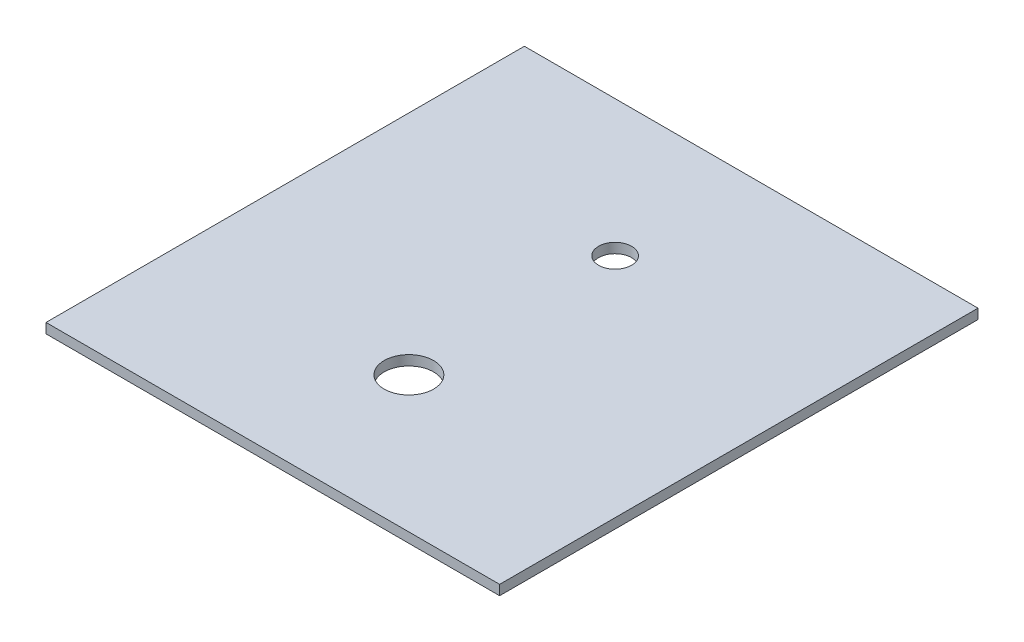
ISO-10303-21;
HEADER;
FILE_DESCRIPTION(('STEP AP214'),'2;1');
FILE_NAME('part.step','',(''),(''),'','','');
FILE_SCHEMA(('AUTOMOTIVE_DESIGN { 1 0 10303 214 1 1 1 1 }'));
ENDSEC;
DATA;
#1=APPLICATION_CONTEXT('core data for automotive mechanical design processes');
#2=APPLICATION_PROTOCOL_DEFINITION('international standard','automotive_design',2000,#1);
#3=PRODUCT_CONTEXT('',#1,'mechanical');
#4=PRODUCT('Part','Part','',(#3));
#5=PRODUCT_RELATED_PRODUCT_CATEGORY('part','',(#4));
#6=PRODUCT_DEFINITION_FORMATION('','',#4);
#7=PRODUCT_DEFINITION_CONTEXT('part definition',#1,'design');
#8=PRODUCT_DEFINITION('design','',#6,#7);
#9=PRODUCT_DEFINITION_SHAPE('','',#8);
#10=(LENGTH_UNIT() NAMED_UNIT(*) SI_UNIT(.MILLI.,.METRE.));
#11=(NAMED_UNIT(*) PLANE_ANGLE_UNIT() SI_UNIT($,.RADIAN.));
#12=(NAMED_UNIT(*) SI_UNIT($,.STERADIAN.) SOLID_ANGLE_UNIT());
#13=UNCERTAINTY_MEASURE_WITH_UNIT(LENGTH_MEASURE(1.E-05),#10,'distance_accuracy_value','');
#14=(GEOMETRIC_REPRESENTATION_CONTEXT(3) GLOBAL_UNCERTAINTY_ASSIGNED_CONTEXT((#13)) GLOBAL_UNIT_ASSIGNED_CONTEXT((#10,
#11,#12)) REPRESENTATION_CONTEXT('',''));
#15=CARTESIAN_POINT('',(0.,0.,0.));
#16=DIRECTION('',(0.,0.,1.));
#17=DIRECTION('',(1.,0.,0.));
#18=AXIS2_PLACEMENT_3D('',#15,#16,#17);
#19=CARTESIAN_POINT('',(0.,1.2,0.));
#20=DIRECTION('',(0.,1.,0.));
#21=DIRECTION('',(0.,0.,1.));
#22=AXIS2_PLACEMENT_3D('',#19,#20,#21);
#23=PLANE('',#22);
#24=CARTESIAN_POINT('',(0.,1.2,12.5));
#25=DIRECTION('',(0.,1.,0.));
#26=DIRECTION('',(0.,0.,1.));
#27=AXIS2_PLACEMENT_3D('',#24,#25,#26);
#28=CIRCLE('',#27,3.);
#29=CARTESIAN_POINT('',(0.,1.2,15.5));
#30=VERTEX_POINT('',#29);
#31=EDGE_CURVE('E101',#30,#30,#28,.T.);
#32=ORIENTED_EDGE('',*,*,#31,.F.);
#33=EDGE_LOOP('',(#32));
#34=FACE_BOUND('',#33,.T.);
#35=DIRECTION('',(0.,0.,1.));
#36=VECTOR('',#35,1.);
#37=CARTESIAN_POINT('',(-27.5,1.2,29.));
#38=LINE('',#37,#36);
#39=CARTESIAN_POINT('',(-27.5,1.2,-29.));
#40=VERTEX_POINT('',#39);
#41=CARTESIAN_POINT('',(-27.5,1.2,29.));
#42=VERTEX_POINT('',#41);
#43=EDGE_CURVE('E87',#40,#42,#38,.T.);
#44=ORIENTED_EDGE('',*,*,#43,.T.);
#45=DIRECTION('',(1.,0.,0.));
#46=VECTOR('',#45,1.);
#47=CARTESIAN_POINT('',(27.5,1.2,29.));
#48=LINE('',#47,#46);
#49=CARTESIAN_POINT('',(27.5,1.2,29.));
#50=VERTEX_POINT('',#49);
#51=EDGE_CURVE('E84',#42,#50,#48,.T.);
#52=ORIENTED_EDGE('',*,*,#51,.T.);
#53=DIRECTION('',(0.,0.,-1.));
#54=VECTOR('',#53,1.);
#55=CARTESIAN_POINT('',(27.5,1.2,29.));
#56=LINE('',#55,#54);
#57=CARTESIAN_POINT('',(27.5,1.2,-29.));
#58=VERTEX_POINT('',#57);
#59=EDGE_CURVE('E90',#50,#58,#56,.T.);
#60=ORIENTED_EDGE('',*,*,#59,.T.);
#61=DIRECTION('',(-1.,0.,0.));
#62=VECTOR('',#61,1.);
#63=CARTESIAN_POINT('',(27.5,1.2,-29.));
#64=LINE('',#63,#62);
#65=EDGE_CURVE('E53',#58,#40,#64,.T.);
#66=ORIENTED_EDGE('',*,*,#65,.T.);
#67=EDGE_LOOP('',(#44,#52,#60,#66));
#68=FACE_BOUND('',#67,.T.);
#69=CARTESIAN_POINT('',(0.,1.2,-12.5));
#70=DIRECTION('',(0.,1.,0.));
#71=DIRECTION('',(0.,0.,1.));
#72=AXIS2_PLACEMENT_3D('',#69,#70,#71);
#73=CIRCLE('',#72,2.);
#74=CARTESIAN_POINT('',(0.,1.2,-10.5));
#75=VERTEX_POINT('',#74);
#76=EDGE_CURVE('E117',#75,#75,#73,.T.);
#77=ORIENTED_EDGE('',*,*,#76,.F.);
#78=EDGE_LOOP('',(#77));
#79=FACE_BOUND('',#78,.T.);
#80=ADVANCED_FACE('F40',(#34,#68,#79),#23,.T.);
#81=CARTESIAN_POINT('',(0.,0.,0.));
#82=DIRECTION('',(0.,1.,0.));
#83=DIRECTION('',(0.,0.,1.));
#84=AXIS2_PLACEMENT_3D('',#81,#82,#83);
#85=PLANE('',#84);
#86=DIRECTION('',(0.,0.,1.));
#87=VECTOR('',#86,1.);
#88=CARTESIAN_POINT('',(-27.5,0.,29.));
#89=LINE('',#88,#87);
#90=CARTESIAN_POINT('',(-27.5,0.,-29.));
#91=VERTEX_POINT('',#90);
#92=CARTESIAN_POINT('',(-27.5,0.,29.));
#93=VERTEX_POINT('',#92);
#94=EDGE_CURVE('E102',#91,#93,#89,.T.);
#95=ORIENTED_EDGE('',*,*,#94,.F.);
#96=DIRECTION('',(-1.,0.,0.));
#97=VECTOR('',#96,1.);
#98=CARTESIAN_POINT('',(27.5,0.,-29.));
#99=LINE('',#98,#97);
#100=CARTESIAN_POINT('',(27.5,0.,-29.));
#101=VERTEX_POINT('',#100);
#102=EDGE_CURVE('E77',#101,#91,#99,.T.);
#103=ORIENTED_EDGE('',*,*,#102,.F.);
#104=DIRECTION('',(0.,0.,-1.));
#105=VECTOR('',#104,1.);
#106=CARTESIAN_POINT('',(27.5,0.,29.));
#107=LINE('',#106,#105);
#108=CARTESIAN_POINT('',(27.5,0.,29.));
#109=VERTEX_POINT('',#108);
#110=EDGE_CURVE('E73',#109,#101,#107,.T.);
#111=ORIENTED_EDGE('',*,*,#110,.F.);
#112=DIRECTION('',(1.,0.,0.));
#113=VECTOR('',#112,1.);
#114=CARTESIAN_POINT('',(27.5,0.,29.));
#115=LINE('',#114,#113);
#116=EDGE_CURVE('E93',#93,#109,#115,.T.);
#117=ORIENTED_EDGE('',*,*,#116,.F.);
#118=EDGE_LOOP('',(#95,#103,#111,#117));
#119=FACE_BOUND('',#118,.T.);
#120=CARTESIAN_POINT('',(0.,0.,12.5));
#121=DIRECTION('',(0.,1.,0.));
#122=DIRECTION('',(0.,0.,1.));
#123=AXIS2_PLACEMENT_3D('',#120,#121,#122);
#124=CIRCLE('',#123,3.);
#125=CARTESIAN_POINT('',(0.,0.,15.5));
#126=VERTEX_POINT('',#125);
#127=EDGE_CURVE('E118',#126,#126,#124,.T.);
#128=ORIENTED_EDGE('',*,*,#127,.T.);
#129=EDGE_LOOP('',(#128));
#130=FACE_BOUND('',#129,.T.);
#131=CARTESIAN_POINT('',(0.,0.,-12.5));
#132=DIRECTION('',(0.,1.,0.));
#133=DIRECTION('',(0.,0.,1.));
#134=AXIS2_PLACEMENT_3D('',#131,#132,#133);
#135=CIRCLE('',#134,2.);
#136=CARTESIAN_POINT('',(0.,0.,-10.5));
#137=VERTEX_POINT('',#136);
#138=EDGE_CURVE('E122',#137,#137,#135,.T.);
#139=ORIENTED_EDGE('',*,*,#138,.T.);
#140=EDGE_LOOP('',(#139));
#141=FACE_BOUND('',#140,.T.);
#142=ADVANCED_FACE('F115',(#119,#130,#141),#85,.F.);
#143=CARTESIAN_POINT('',(-27.5,1.2,29.));
#144=DIRECTION('',(1.,0.,0.));
#145=DIRECTION('',(0.,0.,-1.));
#146=AXIS2_PLACEMENT_3D('',#143,#144,#145);
#147=PLANE('',#146);
#148=ORIENTED_EDGE('',*,*,#94,.T.);
#149=DIRECTION('',(0.,-1.,0.));
#150=VECTOR('',#149,1.);
#151=CARTESIAN_POINT('',(-27.5,1.2,29.));
#152=LINE('',#151,#150);
#153=EDGE_CURVE('E11',#42,#93,#152,.T.);
#154=ORIENTED_EDGE('',*,*,#153,.F.);
#155=ORIENTED_EDGE('',*,*,#43,.F.);
#156=DIRECTION('',(0.,-1.,0.));
#157=VECTOR('',#156,1.);
#158=CARTESIAN_POINT('',(-27.5,1.2,-29.));
#159=LINE('',#158,#157);
#160=EDGE_CURVE('E100',#40,#91,#159,.T.);
#161=ORIENTED_EDGE('',*,*,#160,.T.);
#162=EDGE_LOOP('',(#148,#154,#155,#161));
#163=FACE_BOUND('',#162,.T.);
#164=ADVANCED_FACE('F39',(#163),#147,.F.);
#165=CARTESIAN_POINT('',(27.5,1.2,29.));
#166=DIRECTION('',(0.,0.,-1.));
#167=DIRECTION('',(-1.,0.,0.));
#168=AXIS2_PLACEMENT_3D('',#165,#166,#167);
#169=PLANE('',#168);
#170=ORIENTED_EDGE('',*,*,#116,.T.);
#171=DIRECTION('',(0.,-1.,0.));
#172=VECTOR('',#171,1.);
#173=CARTESIAN_POINT('',(27.5,1.2,29.));
#174=LINE('',#173,#172);
#175=EDGE_CURVE('E46',#50,#109,#174,.T.);
#176=ORIENTED_EDGE('',*,*,#175,.F.);
#177=ORIENTED_EDGE('',*,*,#51,.F.);
#178=ORIENTED_EDGE('',*,*,#153,.T.);
#179=EDGE_LOOP('',(#170,#176,#177,#178));
#180=FACE_BOUND('',#179,.T.);
#181=ADVANCED_FACE('F95',(#180),#169,.F.);
#182=CARTESIAN_POINT('',(27.5,1.2,29.));
#183=DIRECTION('',(-1.,0.,0.));
#184=DIRECTION('',(0.,0.,1.));
#185=AXIS2_PLACEMENT_3D('',#182,#183,#184);
#186=PLANE('',#185);
#187=ORIENTED_EDGE('',*,*,#110,.T.);
#188=DIRECTION('',(0.,-1.,0.));
#189=VECTOR('',#188,1.);
#190=CARTESIAN_POINT('',(27.5,1.2,-29.));
#191=LINE('',#190,#189);
#192=EDGE_CURVE('E92',#58,#101,#191,.T.);
#193=ORIENTED_EDGE('',*,*,#192,.F.);
#194=ORIENTED_EDGE('',*,*,#59,.F.);
#195=ORIENTED_EDGE('',*,*,#175,.T.);
#196=EDGE_LOOP('',(#187,#193,#194,#195));
#197=FACE_BOUND('',#196,.T.);
#198=ADVANCED_FACE('F94',(#197),#186,.F.);
#199=CARTESIAN_POINT('',(27.5,1.2,-29.));
#200=DIRECTION('',(0.,0.,1.));
#201=DIRECTION('',(1.,0.,0.));
#202=AXIS2_PLACEMENT_3D('',#199,#200,#201);
#203=PLANE('',#202);
#204=ORIENTED_EDGE('',*,*,#102,.T.);
#205=ORIENTED_EDGE('',*,*,#160,.F.);
#206=ORIENTED_EDGE('',*,*,#65,.F.);
#207=ORIENTED_EDGE('',*,*,#192,.T.);
#208=EDGE_LOOP('',(#204,#205,#206,#207));
#209=FACE_BOUND('',#208,.T.);
#210=ADVANCED_FACE('F107',(#209),#203,.F.);
#211=CARTESIAN_POINT('',(0.,1.2,12.5));
#212=DIRECTION('',(0.,-1.,0.));
#213=DIRECTION('',(0.,0.,-1.));
#214=AXIS2_PLACEMENT_3D('',#211,#212,#213);
#215=CYLINDRICAL_SURFACE('',#214,3.);
#216=ORIENTED_EDGE('',*,*,#31,.T.);
#217=EDGE_LOOP('',(#216));
#218=FACE_BOUND('',#217,.T.);
#219=ORIENTED_EDGE('',*,*,#127,.F.);
#220=EDGE_LOOP('',(#219));
#221=FACE_BOUND('',#220,.T.);
#222=ADVANCED_FACE('F137',(#218,#221),#215,.F.);
#223=CARTESIAN_POINT('',(0.,1.2,-12.5));
#224=DIRECTION('',(0.,-1.,0.));
#225=DIRECTION('',(0.,0.,-1.));
#226=AXIS2_PLACEMENT_3D('',#223,#224,#225);
#227=CYLINDRICAL_SURFACE('',#226,2.);
#228=ORIENTED_EDGE('',*,*,#76,.T.);
#229=EDGE_LOOP('',(#228));
#230=FACE_BOUND('',#229,.T.);
#231=ORIENTED_EDGE('',*,*,#138,.F.);
#232=EDGE_LOOP('',(#231));
#233=FACE_BOUND('',#232,.T.);
#234=ADVANCED_FACE('F126',(#230,#233),#227,.F.);
#235=CLOSED_SHELL('',(#80,#142,#164,#181,#198,#210,#222,#234));
#236=MANIFOLD_SOLID_BREP('B2',#235);
#237=ADVANCED_BREP_SHAPE_REPRESENTATION('',(#18,#236),#14);
#238=SHAPE_DEFINITION_REPRESENTATION(#9,#237);
ENDSEC;
END-ISO-10303-21;
